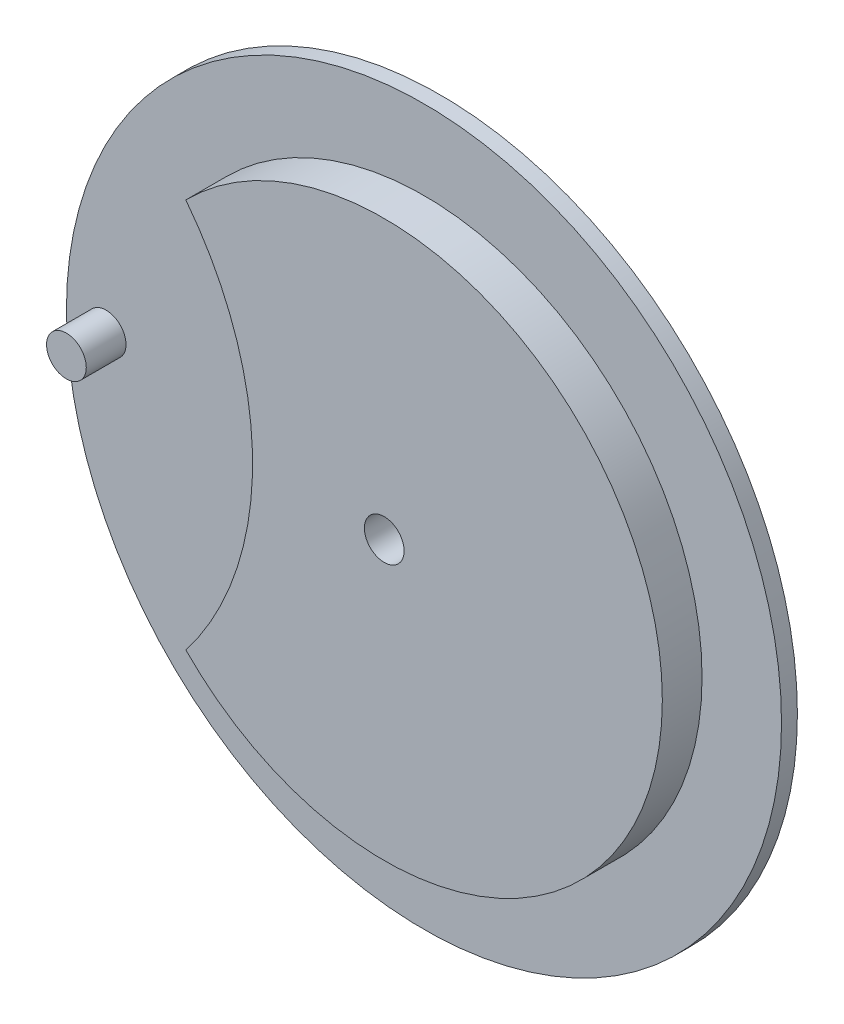
ISO-10303-21;
HEADER;
FILE_DESCRIPTION(('STEP AP214'),'2;1');
FILE_NAME('part.step','',(''),(''),'','','');
FILE_SCHEMA(('AUTOMOTIVE_DESIGN { 1 0 10303 214 1 1 1 1 }'));
ENDSEC;
DATA;
#1=APPLICATION_CONTEXT('core data for automotive mechanical design processes');
#2=APPLICATION_PROTOCOL_DEFINITION('international standard','automotive_design',2000,#1);
#3=PRODUCT_CONTEXT('',#1,'mechanical');
#4=PRODUCT('Part','Part','',(#3));
#5=PRODUCT_RELATED_PRODUCT_CATEGORY('part','',(#4));
#6=PRODUCT_DEFINITION_FORMATION('','',#4);
#7=PRODUCT_DEFINITION_CONTEXT('part definition',#1,'design');
#8=PRODUCT_DEFINITION('design','',#6,#7);
#9=PRODUCT_DEFINITION_SHAPE('','',#8);
#10=(LENGTH_UNIT() NAMED_UNIT(*) SI_UNIT(.MILLI.,.METRE.));
#11=(NAMED_UNIT(*) PLANE_ANGLE_UNIT() SI_UNIT($,.RADIAN.));
#12=(NAMED_UNIT(*) SI_UNIT($,.STERADIAN.) SOLID_ANGLE_UNIT());
#13=UNCERTAINTY_MEASURE_WITH_UNIT(LENGTH_MEASURE(1.E-05),#10,'distance_accuracy_value','');
#14=(GEOMETRIC_REPRESENTATION_CONTEXT(3) GLOBAL_UNCERTAINTY_ASSIGNED_CONTEXT((#13)) GLOBAL_UNIT_ASSIGNED_CONTEXT((#10,
#11,#12)) REPRESENTATION_CONTEXT('',''));
#15=CARTESIAN_POINT('',(0.,0.,0.));
#16=DIRECTION('',(0.,0.,1.));
#17=DIRECTION('',(1.,0.,0.));
#18=AXIS2_PLACEMENT_3D('',#15,#16,#17);
#19=CARTESIAN_POINT('',(0.,0.,-0.159));
#20=DIRECTION('',(0.,0.,1.));
#21=DIRECTION('',(1.,0.,0.));
#22=AXIS2_PLACEMENT_3D('',#19,#20,#21);
#23=CYLINDRICAL_SURFACE('',#22,0.19875);
#24=CARTESIAN_POINT('',(0.,0.,-0.159));
#25=DIRECTION('',(0.,0.,1.));
#26=DIRECTION('',(1.,0.,0.));
#27=AXIS2_PLACEMENT_3D('',#24,#25,#26);
#28=CIRCLE('',#27,0.19875);
#29=CARTESIAN_POINT('',(0.19875,0.,-0.159));
#30=VERTEX_POINT('',#29);
#31=EDGE_CURVE('E52',#30,#30,#28,.T.);
#32=ORIENTED_EDGE('',*,*,#31,.F.);
#33=EDGE_LOOP('',(#32));
#34=FACE_BOUND('',#33,.T.);
#35=CARTESIAN_POINT('',(0.,0.,0.3975));
#36=DIRECTION('',(0.,0.,1.));
#37=DIRECTION('',(1.,0.,0.));
#38=AXIS2_PLACEMENT_3D('',#35,#36,#37);
#39=CIRCLE('',#38,0.19875);
#40=CARTESIAN_POINT('',(0.19875,0.,0.3975));
#41=VERTEX_POINT('',#40);
#42=EDGE_CURVE('E79',#41,#41,#39,.T.);
#43=ORIENTED_EDGE('',*,*,#42,.T.);
#44=EDGE_LOOP('',(#43));
#45=FACE_BOUND('',#44,.T.);
#46=ADVANCED_FACE('F43',(#34,#45),#23,.F.);
#47=CARTESIAN_POINT('',(0.,0.,-0.159));
#48=DIRECTION('',(0.,0.,1.));
#49=DIRECTION('',(1.,0.,0.));
#50=AXIS2_PLACEMENT_3D('',#47,#48,#49);
#51=CYLINDRICAL_SURFACE('',#50,3.5775);
#52=CARTESIAN_POINT('',(0.,0.,-0.159));
#53=DIRECTION('',(0.,0.,1.));
#54=DIRECTION('',(1.,0.,0.));
#55=AXIS2_PLACEMENT_3D('',#52,#53,#54);
#56=CIRCLE('',#55,3.5775);
#57=CARTESIAN_POINT('',(3.5775,0.,-0.159));
#58=VERTEX_POINT('',#57);
#59=EDGE_CURVE('E11',#58,#58,#56,.T.);
#60=CARTESIAN_POINT('',(0.,0.,0.));
#61=DIRECTION('',(0.,0.,1.));
#62=DIRECTION('',(1.,0.,0.));
#63=AXIS2_PLACEMENT_3D('',#60,#61,#62);
#64=CIRCLE('',#63,3.5775);
#65=CARTESIAN_POINT('',(3.5775,0.,0.));
#66=VERTEX_POINT('',#65);
#67=EDGE_CURVE('E46',#66,#66,#64,.T.);
#68=CARTESIAN_POINT('',(3.5775,0.,-0.159));
#69=CARTESIAN_POINT('',(3.5775,0.,-0.15734375));
#70=CARTESIAN_POINT('',(3.5775,0.,-0.1556875));
#71=CARTESIAN_POINT('',(3.5775,0.,-0.152375));
#72=CARTESIAN_POINT('',(3.5775,0.,-0.15071875));
#73=CARTESIAN_POINT('',(3.5775,0.,-0.14740625));
#74=CARTESIAN_POINT('',(3.5775,0.,-0.14575));
#75=CARTESIAN_POINT('',(3.5775,0.,-0.1424375));
#76=CARTESIAN_POINT('',(3.5775,0.,-0.14078125));
#77=CARTESIAN_POINT('',(3.5775,0.,-0.13746875));
#78=CARTESIAN_POINT('',(3.5775,0.,-0.1358125));
#79=CARTESIAN_POINT('',(3.5775,0.,-0.1325));
#80=CARTESIAN_POINT('',(3.5775,0.,-0.13084375));
#81=CARTESIAN_POINT('',(3.5775,0.,-0.12753125));
#82=CARTESIAN_POINT('',(3.5775,0.,-0.125875));
#83=CARTESIAN_POINT('',(3.5775,0.,-0.1225625));
#84=CARTESIAN_POINT('',(3.5775,0.,-0.12090625));
#85=CARTESIAN_POINT('',(3.5775,0.,-0.11759375));
#86=CARTESIAN_POINT('',(3.5775,0.,-0.1159375));
#87=CARTESIAN_POINT('',(3.5775,0.,-0.112625));
#88=CARTESIAN_POINT('',(3.5775,0.,-0.11096875));
#89=CARTESIAN_POINT('',(3.5775,0.,-0.10765625));
#90=CARTESIAN_POINT('',(3.5775,0.,-0.106));
#91=CARTESIAN_POINT('',(3.5775,0.,-0.1026875));
#92=CARTESIAN_POINT('',(3.5775,0.,-0.10103125));
#93=CARTESIAN_POINT('',(3.5775,0.,-0.09771875));
#94=CARTESIAN_POINT('',(3.5775,0.,-0.0960625));
#95=CARTESIAN_POINT('',(3.5775,0.,-0.09275));
#96=CARTESIAN_POINT('',(3.5775,0.,-0.09109375));
#97=CARTESIAN_POINT('',(3.5775,0.,-0.08778125));
#98=CARTESIAN_POINT('',(3.5775,0.,-0.086125));
#99=CARTESIAN_POINT('',(3.5775,0.,-0.0828125));
#100=CARTESIAN_POINT('',(3.5775,0.,-0.08115625));
#101=CARTESIAN_POINT('',(3.5775,0.,-0.07784375));
#102=CARTESIAN_POINT('',(3.5775,0.,-0.0761875));
#103=CARTESIAN_POINT('',(3.5775,0.,-0.072875));
#104=CARTESIAN_POINT('',(3.5775,0.,-0.07121875));
#105=CARTESIAN_POINT('',(3.5775,0.,-0.06790625));
#106=CARTESIAN_POINT('',(3.5775,0.,-0.06625));
#107=CARTESIAN_POINT('',(3.5775,0.,-0.0629375));
#108=CARTESIAN_POINT('',(3.5775,0.,-0.06128125));
#109=CARTESIAN_POINT('',(3.5775,0.,-0.05796875));
#110=CARTESIAN_POINT('',(3.5775,0.,-0.0563125));
#111=CARTESIAN_POINT('',(3.5775,0.,-0.053));
#112=CARTESIAN_POINT('',(3.5775,0.,-0.05134375));
#113=CARTESIAN_POINT('',(3.5775,0.,-0.04803125));
#114=CARTESIAN_POINT('',(3.5775,0.,-0.046375));
#115=CARTESIAN_POINT('',(3.5775,0.,-0.0430625));
#116=CARTESIAN_POINT('',(3.5775,0.,-0.04140625));
#117=CARTESIAN_POINT('',(3.5775,0.,-0.03809375));
#118=CARTESIAN_POINT('',(3.5775,0.,-0.0364375));
#119=CARTESIAN_POINT('',(3.5775,0.,-0.033125));
#120=CARTESIAN_POINT('',(3.5775,0.,-0.03146875));
#121=CARTESIAN_POINT('',(3.5775,0.,-0.02815625));
#122=CARTESIAN_POINT('',(3.5775,0.,-0.0265));
#123=CARTESIAN_POINT('',(3.5775,0.,-0.0231875));
#124=CARTESIAN_POINT('',(3.5775,0.,-0.02153125));
#125=CARTESIAN_POINT('',(3.5775,0.,-0.01821875));
#126=CARTESIAN_POINT('',(3.5775,0.,-0.0165625));
#127=CARTESIAN_POINT('',(3.5775,0.,-0.01325));
#128=CARTESIAN_POINT('',(3.5775,0.,-0.01159375));
#129=CARTESIAN_POINT('',(3.5775,0.,-0.00828125000000002));
#130=CARTESIAN_POINT('',(3.5775,0.,-0.00662500000000003));
#131=CARTESIAN_POINT('',(3.5775,0.,-0.00331250000000003));
#132=CARTESIAN_POINT('',(3.5775,0.,-0.00165625000000003));
#133=CARTESIAN_POINT('',(3.5775,0.,0.));
#134=B_SPLINE_CURVE_WITH_KNOTS('',3,(#68,#69,#70,#71,#72,#73,#74,#75,#76,#77,#78,#79,#80,#81,
#82,#83,#84,#85,#86,#87,#88,#89,#90,#91,#92,#93,#94,#95,#96,#97,#98,#99,#100,#101,#102,#103,
#104,#105,#106,#107,#108,#109,#110,#111,#112,#113,#114,#115,#116,#117,#118,#119,#120,#121,#122,
#123,#124,#125,#126,#127,#128,#129,#130,#131,#132,#133),.UNSPECIFIED.,.F.,.F.,(4,2,2,2,2,2,2,2,
2,2,2,2,2,2,2,2,2,2,2,2,2,2,2,2,2,2,2,2,2,2,2,2,4),(0.,0.00496874999999998,0.00993749999999999,
0.01490625,0.019875,0.02484375,0.0298125,0.03478125,0.03975,0.04471875,0.0496875,0.05465625,
0.059625,0.06459375,0.0695625,0.07453125,0.0795,0.08446875,0.0894375,0.09440625,0.099375,
0.10434375,0.1093125,0.11428125,0.11925,0.12421875,0.1291875,0.13415625,0.139125,0.14409375,
0.1490625,0.15403125,0.159),.UNSPECIFIED.);
#135=EDGE_CURVE('BSEAM109',#58,#66,#134,.T.);
#136=ORIENTED_EDGE('',*,*,#59,.T.);
#137=ORIENTED_EDGE('',*,*,#67,.F.);
#138=ORIENTED_EDGE('',*,*,#135,.T.);
#139=ORIENTED_EDGE('',*,*,#135,.F.);
#140=EDGE_LOOP('',(#136,#138,#137,#139));
#141=FACE_BOUND('',#140,.T.);
#142=ADVANCED_FACE('F109',(#141),#51,.T.);
#143=CARTESIAN_POINT('',(0.,0.,-0.159));
#144=DIRECTION('',(0.,0.,1.));
#145=DIRECTION('',(1.,0.,0.));
#146=AXIS2_PLACEMENT_3D('',#143,#144,#145);
#147=PLANE('',#146);
#148=ORIENTED_EDGE('',*,*,#31,.T.);
#149=EDGE_LOOP('',(#148));
#150=FACE_BOUND('',#149,.T.);
#151=ORIENTED_EDGE('',*,*,#59,.F.);
#152=EDGE_LOOP('',(#151));
#153=FACE_BOUND('',#152,.T.);
#154=ADVANCED_FACE('F111',(#150,#153),#147,.F.);
#155=CARTESIAN_POINT('',(0.,0.,0.));
#156=DIRECTION('',(0.,0.,1.));
#157=DIRECTION('',(1.,0.,0.));
#158=AXIS2_PLACEMENT_3D('',#155,#156,#157);
#159=PLANE('',#158);
#160=CARTESIAN_POINT('',(-3.18,0.,0.));
#161=DIRECTION('',(0.,0.,1.));
#162=DIRECTION('',(1.,0.,0.));
#163=AXIS2_PLACEMENT_3D('',#160,#161,#162);
#164=CIRCLE('',#163,0.19875);
#165=CARTESIAN_POINT('',(-2.98125,0.,0.));
#166=VERTEX_POINT('',#165);
#167=EDGE_CURVE('E94',#166,#166,#164,.T.);
#168=ORIENTED_EDGE('',*,*,#167,.F.);
#169=EDGE_LOOP('',(#168));
#170=FACE_BOUND('',#169,.T.);
#171=CARTESIAN_POINT('',(-4.49719912834645,0.,0.));
#172=DIRECTION('',(0.,0.,1.));
#173=DIRECTION('',(1.,0.,0.));
#174=AXIS2_PLACEMENT_3D('',#171,#172,#173);
#175=CIRCLE('',#174,3.18000000000001);
#176=CARTESIAN_POINT('',(-1.98509180274667,-1.94979916521368,0.));
#177=VERTEX_POINT('',#176);
#178=CARTESIAN_POINT('',(-1.98509180274667,1.94979916521369,0.));
#179=VERTEX_POINT('',#178);
#180=EDGE_CURVE('E59',#177,#179,#175,.T.);
#181=ORIENTED_EDGE('',*,*,#180,.T.);
#182=CARTESIAN_POINT('',(0.,0.,0.));
#183=DIRECTION('',(0.,0.,1.));
#184=DIRECTION('',(1.,0.,0.));
#185=AXIS2_PLACEMENT_3D('',#182,#183,#184);
#186=CIRCLE('',#185,2.7825);
#187=EDGE_CURVE('E82',#177,#179,#186,.T.);
#188=ORIENTED_EDGE('',*,*,#187,.F.);
#189=EDGE_LOOP('',(#181,#188));
#190=FACE_BOUND('',#189,.T.);
#191=ORIENTED_EDGE('',*,*,#67,.T.);
#192=EDGE_LOOP('',(#191));
#193=FACE_BOUND('',#192,.T.);
#194=ADVANCED_FACE('F87',(#170,#190,#193),#159,.T.);
#195=CARTESIAN_POINT('',(-4.49719912834645,0.,0.3975));
#196=DIRECTION('',(0.,0.,-1.));
#197=DIRECTION('',(-1.,0.,0.));
#198=AXIS2_PLACEMENT_3D('',#195,#196,#197);
#199=CYLINDRICAL_SURFACE('',#198,3.18000000000001);
#200=ORIENTED_EDGE('',*,*,#180,.F.);
#201=DIRECTION('',(0.,0.,-1.));
#202=VECTOR('',#201,1.);
#203=CARTESIAN_POINT('',(-1.98509180274667,-1.94979916521368,0.3975));
#204=LINE('',#203,#202);
#205=CARTESIAN_POINT('',(-1.98509180274667,-1.94979916521368,0.3975));
#206=VERTEX_POINT('',#205);
#207=EDGE_CURVE('E78',#206,#177,#204,.T.);
#208=ORIENTED_EDGE('',*,*,#207,.F.);
#209=CARTESIAN_POINT('',(-4.49719912834645,0.,0.3975));
#210=DIRECTION('',(0.,0.,1.));
#211=DIRECTION('',(1.,0.,0.));
#212=AXIS2_PLACEMENT_3D('',#209,#210,#211);
#213=CIRCLE('',#212,3.18000000000001);
#214=CARTESIAN_POINT('',(-1.98509180274667,1.94979916521369,0.3975));
#215=VERTEX_POINT('',#214);
#216=EDGE_CURVE('E75',#206,#215,#213,.T.);
#217=ORIENTED_EDGE('',*,*,#216,.T.);
#218=DIRECTION('',(0.,0.,-1.));
#219=VECTOR('',#218,1.);
#220=CARTESIAN_POINT('',(-1.98509180274667,1.94979916521369,0.3975));
#221=LINE('',#220,#219);
#222=EDGE_CURVE('E72',#215,#179,#221,.T.);
#223=ORIENTED_EDGE('',*,*,#222,.T.);
#224=EDGE_LOOP('',(#200,#208,#217,#223));
#225=FACE_BOUND('',#224,.T.);
#226=ADVANCED_FACE('F74',(#225),#199,.F.);
#227=CARTESIAN_POINT('',(0.,0.,0.3975));
#228=DIRECTION('',(0.,0.,-1.));
#229=DIRECTION('',(-1.,0.,0.));
#230=AXIS2_PLACEMENT_3D('',#227,#228,#229);
#231=CYLINDRICAL_SURFACE('',#230,2.7825);
#232=ORIENTED_EDGE('',*,*,#187,.T.);
#233=ORIENTED_EDGE('',*,*,#222,.F.);
#234=CARTESIAN_POINT('',(0.,0.,0.3975));
#235=DIRECTION('',(0.,0.,1.));
#236=DIRECTION('',(1.,0.,0.));
#237=AXIS2_PLACEMENT_3D('',#234,#235,#236);
#238=CIRCLE('',#237,2.7825);
#239=EDGE_CURVE('E67',#206,#215,#238,.T.);
#240=ORIENTED_EDGE('',*,*,#239,.F.);
#241=ORIENTED_EDGE('',*,*,#207,.T.);
#242=EDGE_LOOP('',(#232,#233,#240,#241));
#243=FACE_BOUND('',#242,.T.);
#244=ADVANCED_FACE('F83',(#243),#231,.T.);
#245=CARTESIAN_POINT('',(0.,0.,0.3975));
#246=DIRECTION('',(0.,0.,1.));
#247=DIRECTION('',(1.,0.,0.));
#248=AXIS2_PLACEMENT_3D('',#245,#246,#247);
#249=PLANE('',#248);
#250=ORIENTED_EDGE('',*,*,#216,.F.);
#251=ORIENTED_EDGE('',*,*,#239,.T.);
#252=EDGE_LOOP('',(#250,#251));
#253=FACE_BOUND('',#252,.T.);
#254=ORIENTED_EDGE('',*,*,#42,.F.);
#255=EDGE_LOOP('',(#254));
#256=FACE_BOUND('',#255,.T.);
#257=ADVANCED_FACE('F127',(#253,#256),#249,.T.);
#258=CARTESIAN_POINT('',(-3.18,0.,0.3975));
#259=DIRECTION('',(0.,0.,-1.));
#260=DIRECTION('',(-1.,0.,0.));
#261=AXIS2_PLACEMENT_3D('',#258,#259,#260);
#262=CYLINDRICAL_SURFACE('',#261,0.19875);
#263=CARTESIAN_POINT('',(-3.18,0.,0.3975));
#264=DIRECTION('',(0.,0.,1.));
#265=DIRECTION('',(1.,0.,0.));
#266=AXIS2_PLACEMENT_3D('',#263,#264,#265);
#267=CIRCLE('',#266,0.19875);
#268=CARTESIAN_POINT('',(-2.98125,0.,0.3975));
#269=VERTEX_POINT('',#268);
#270=EDGE_CURVE('E90',#269,#269,#267,.T.);
#271=ORIENTED_EDGE('',*,*,#270,.F.);
#272=EDGE_LOOP('',(#271));
#273=FACE_BOUND('',#272,.T.);
#274=ORIENTED_EDGE('',*,*,#167,.T.);
#275=EDGE_LOOP('',(#274));
#276=FACE_BOUND('',#275,.T.);
#277=ADVANCED_FACE('F130',(#273,#276),#262,.T.);
#278=CARTESIAN_POINT('',(0.,0.,0.3975));
#279=DIRECTION('',(0.,0.,1.));
#280=DIRECTION('',(1.,0.,0.));
#281=AXIS2_PLACEMENT_3D('',#278,#279,#280);
#282=PLANE('',#281);
#283=ORIENTED_EDGE('',*,*,#270,.T.);
#284=EDGE_LOOP('',(#283));
#285=FACE_BOUND('',#284,.T.);
#286=ADVANCED_FACE('F133',(#285),#282,.T.);
#287=CLOSED_SHELL('',(#46,#142,#154,#194,#226,#244,#257,#277,#286));
#288=MANIFOLD_SOLID_BREP('B2',#287);
#289=ADVANCED_BREP_SHAPE_REPRESENTATION('',(#18,#288),#14);
#290=SHAPE_DEFINITION_REPRESENTATION(#9,#289);
ENDSEC;
END-ISO-10303-21;
